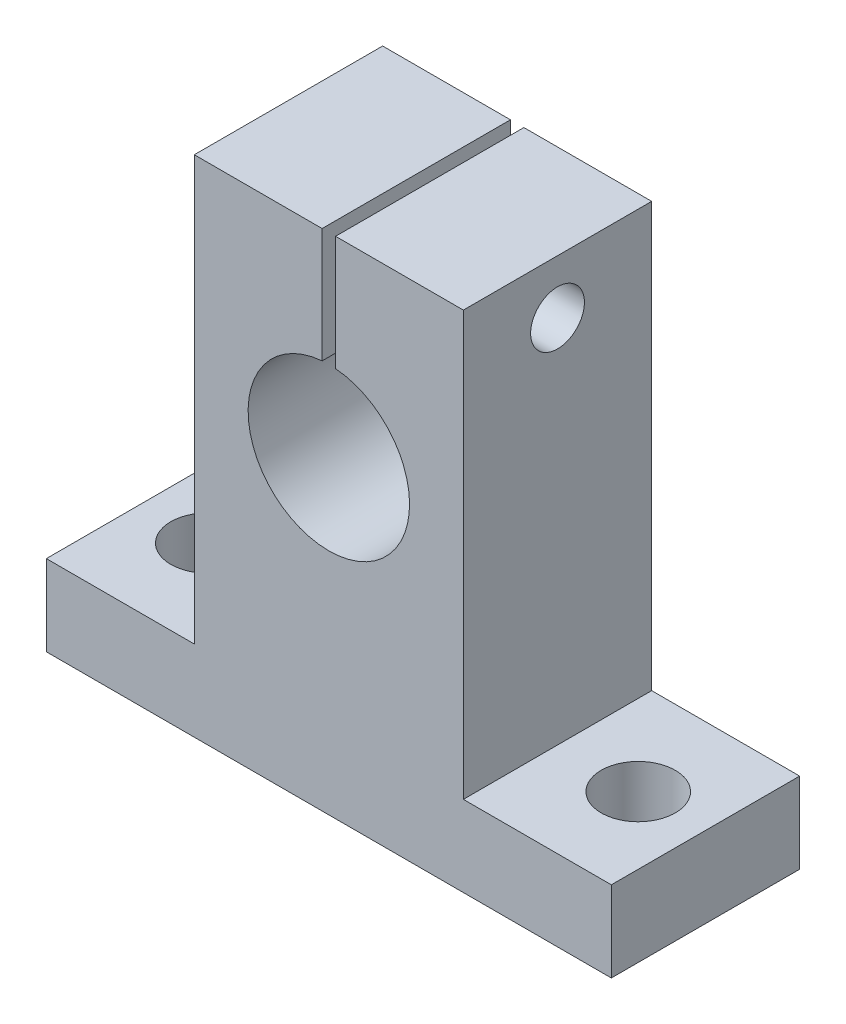
ISO-10303-21;
HEADER;
FILE_DESCRIPTION(('STEP AP214'),'2;1');
FILE_NAME('part.step','',(''),(''),'','','');
FILE_SCHEMA(('AUTOMOTIVE_DESIGN { 1 0 10303 214 1 1 1 1 }'));
ENDSEC;
DATA;
#1=APPLICATION_CONTEXT('core data for automotive mechanical design processes');
#2=APPLICATION_PROTOCOL_DEFINITION('international standard','automotive_design',2000,#1);
#3=PRODUCT_CONTEXT('',#1,'mechanical');
#4=PRODUCT('Part','Part','',(#3));
#5=PRODUCT_RELATED_PRODUCT_CATEGORY('part','',(#4));
#6=PRODUCT_DEFINITION_FORMATION('','',#4);
#7=PRODUCT_DEFINITION_CONTEXT('part definition',#1,'design');
#8=PRODUCT_DEFINITION('design','',#6,#7);
#9=PRODUCT_DEFINITION_SHAPE('','',#8);
#10=(LENGTH_UNIT() NAMED_UNIT(*) SI_UNIT(.MILLI.,.METRE.));
#11=(NAMED_UNIT(*) PLANE_ANGLE_UNIT() SI_UNIT($,.RADIAN.));
#12=(NAMED_UNIT(*) SI_UNIT($,.STERADIAN.) SOLID_ANGLE_UNIT());
#13=UNCERTAINTY_MEASURE_WITH_UNIT(LENGTH_MEASURE(1.E-05),#10,'distance_accuracy_value','');
#14=(GEOMETRIC_REPRESENTATION_CONTEXT(3) GLOBAL_UNCERTAINTY_ASSIGNED_CONTEXT((#13)) GLOBAL_UNIT_ASSIGNED_CONTEXT((#10,
#11,#12)) REPRESENTATION_CONTEXT('',''));
#15=CARTESIAN_POINT('',(0.,0.,0.));
#16=DIRECTION('',(0.,0.,1.));
#17=DIRECTION('',(1.,0.,0.));
#18=AXIS2_PLACEMENT_3D('',#15,#16,#17);
#19=CARTESIAN_POINT('',(0.,0.,14.));
#20=DIRECTION('',(0.,0.,-1.));
#21=DIRECTION('',(-1.,0.,0.));
#22=AXIS2_PLACEMENT_3D('',#19,#20,#21);
#23=PLANE('',#22);
#24=DIRECTION('',(0.,-1.,0.));
#25=VECTOR('',#24,1.);
#26=CARTESIAN_POINT('',(0.499999999999999,37.5,14.));
#27=LINE('',#26,#25);
#28=CARTESIAN_POINT('',(0.499999999999999,37.5,14.));
#29=VERTEX_POINT('',#28);
#30=CARTESIAN_POINT('',(0.5,28.9791303715507,14.));
#31=VERTEX_POINT('',#30);
#32=EDGE_CURVE('E127',#29,#31,#27,.T.);
#33=ORIENTED_EDGE('',*,*,#32,.T.);
#34=CARTESIAN_POINT('',(0.,23.,14.));
#35=DIRECTION('',(0.,0.,1.));
#36=DIRECTION('',(1.,0.,0.));
#37=AXIS2_PLACEMENT_3D('',#34,#35,#36);
#38=CIRCLE('',#37,6.);
#39=CARTESIAN_POINT('',(-0.499999999999999,28.9791303715507,14.));
#40=VERTEX_POINT('',#39);
#41=EDGE_CURVE('E172',#40,#31,#38,.T.);
#42=ORIENTED_EDGE('',*,*,#41,.F.);
#43=DIRECTION('',(0.,-1.,0.));
#44=VECTOR('',#43,1.);
#45=CARTESIAN_POINT('',(-0.5,37.5,14.));
#46=LINE('',#45,#44);
#47=CARTESIAN_POINT('',(-0.5,37.5,14.));
#48=VERTEX_POINT('',#47);
#49=EDGE_CURVE('E63',#48,#40,#46,.T.);
#50=ORIENTED_EDGE('',*,*,#49,.F.);
#51=DIRECTION('',(-1.,0.,0.));
#52=VECTOR('',#51,1.);
#53=CARTESIAN_POINT('',(-10.,37.5,14.));
#54=LINE('',#53,#52);
#55=CARTESIAN_POINT('',(-10.,37.5,14.));
#56=VERTEX_POINT('',#55);
#57=EDGE_CURVE('E155',#48,#56,#54,.T.);
#58=ORIENTED_EDGE('',*,*,#57,.T.);
#59=DIRECTION('',(0.,-1.,0.));
#60=VECTOR('',#59,1.);
#61=CARTESIAN_POINT('',(-10.,6.,14.));
#62=LINE('',#61,#60);
#63=CARTESIAN_POINT('',(-10.,6.,14.));
#64=VERTEX_POINT('',#63);
#65=EDGE_CURVE('E154',#56,#64,#62,.T.);
#66=ORIENTED_EDGE('',*,*,#65,.T.);
#67=DIRECTION('',(-1.,0.,0.));
#68=VECTOR('',#67,1.);
#69=CARTESIAN_POINT('',(-21.,6.,14.));
#70=LINE('',#69,#68);
#71=CARTESIAN_POINT('',(-21.,6.,14.));
#72=VERTEX_POINT('',#71);
#73=EDGE_CURVE('E159',#64,#72,#70,.T.);
#74=ORIENTED_EDGE('',*,*,#73,.T.);
#75=DIRECTION('',(0.,-1.,0.));
#76=VECTOR('',#75,1.);
#77=CARTESIAN_POINT('',(-21.,0.,14.));
#78=LINE('',#77,#76);
#79=CARTESIAN_POINT('',(-21.,0.,14.));
#80=VERTEX_POINT('',#79);
#81=EDGE_CURVE('E193',#72,#80,#78,.T.);
#82=ORIENTED_EDGE('',*,*,#81,.T.);
#83=DIRECTION('',(1.,0.,0.));
#84=VECTOR('',#83,1.);
#85=CARTESIAN_POINT('',(-21.,0.,14.));
#86=LINE('',#85,#84);
#87=CARTESIAN_POINT('',(21.,0.,14.));
#88=VERTEX_POINT('',#87);
#89=EDGE_CURVE('E249',#80,#88,#86,.T.);
#90=ORIENTED_EDGE('',*,*,#89,.T.);
#91=DIRECTION('',(0.,1.,0.));
#92=VECTOR('',#91,1.);
#93=CARTESIAN_POINT('',(21.,0.,14.));
#94=LINE('',#93,#92);
#95=CARTESIAN_POINT('',(21.,6.00000000000001,14.));
#96=VERTEX_POINT('',#95);
#97=EDGE_CURVE('E252',#88,#96,#94,.T.);
#98=ORIENTED_EDGE('',*,*,#97,.T.);
#99=DIRECTION('',(-1.,0.,0.));
#100=VECTOR('',#99,1.);
#101=CARTESIAN_POINT('',(10.,6.,14.));
#102=LINE('',#101,#100);
#103=CARTESIAN_POINT('',(10.,6.,14.));
#104=VERTEX_POINT('',#103);
#105=EDGE_CURVE('E254',#96,#104,#102,.T.);
#106=ORIENTED_EDGE('',*,*,#105,.T.);
#107=DIRECTION('',(0.,1.,0.));
#108=VECTOR('',#107,1.);
#109=CARTESIAN_POINT('',(10.,6.,14.));
#110=LINE('',#109,#108);
#111=CARTESIAN_POINT('',(10.,37.5,14.));
#112=VERTEX_POINT('',#111);
#113=EDGE_CURVE('E151',#104,#112,#110,.T.);
#114=ORIENTED_EDGE('',*,*,#113,.T.);
#115=EDGE_CURVE('E143',#112,#29,#54,.T.);
#116=ORIENTED_EDGE('',*,*,#115,.T.);
#117=EDGE_LOOP('',(#33,#42,#50,#58,#66,#74,#82,#90,#98,#106,#114,#116));
#118=FACE_BOUND('',#117,.T.);
#119=ADVANCED_FACE('F39',(#118),#23,.F.);
#120=CARTESIAN_POINT('',(0.,0.,0.));
#121=DIRECTION('',(0.,0.,-1.));
#122=DIRECTION('',(-1.,0.,0.));
#123=AXIS2_PLACEMENT_3D('',#120,#121,#122);
#124=PLANE('',#123);
#125=CARTESIAN_POINT('',(0.,23.,0.));
#126=DIRECTION('',(0.,0.,1.));
#127=DIRECTION('',(1.,0.,0.));
#128=AXIS2_PLACEMENT_3D('',#125,#126,#127);
#129=CIRCLE('',#128,6.);
#130=CARTESIAN_POINT('',(-0.499999999999999,28.9791303715507,0.));
#131=VERTEX_POINT('',#130);
#132=CARTESIAN_POINT('',(0.5,28.9791303715507,0.));
#133=VERTEX_POINT('',#132);
#134=EDGE_CURVE('E234',#131,#133,#129,.T.);
#135=ORIENTED_EDGE('',*,*,#134,.T.);
#136=DIRECTION('',(0.,1.,0.));
#137=VECTOR('',#136,1.);
#138=CARTESIAN_POINT('',(0.500000000000003,0.,0.));
#139=LINE('',#138,#137);
#140=CARTESIAN_POINT('',(0.499999999999999,37.5,0.));
#141=VERTEX_POINT('',#140);
#142=EDGE_CURVE('E56',#133,#141,#139,.T.);
#143=ORIENTED_EDGE('',*,*,#142,.T.);
#144=DIRECTION('',(-1.,0.,0.));
#145=VECTOR('',#144,1.);
#146=CARTESIAN_POINT('',(-10.,37.5,0.));
#147=LINE('',#146,#145);
#148=CARTESIAN_POINT('',(10.,37.5,0.));
#149=VERTEX_POINT('',#148);
#150=EDGE_CURVE('E145',#149,#141,#147,.T.);
#151=ORIENTED_EDGE('',*,*,#150,.F.);
#152=DIRECTION('',(0.,1.,0.));
#153=VECTOR('',#152,1.);
#154=CARTESIAN_POINT('',(10.,6.,0.));
#155=LINE('',#154,#153);
#156=CARTESIAN_POINT('',(10.,6.,0.));
#157=VERTEX_POINT('',#156);
#158=EDGE_CURVE('E181',#157,#149,#155,.T.);
#159=ORIENTED_EDGE('',*,*,#158,.F.);
#160=DIRECTION('',(-1.,0.,0.));
#161=VECTOR('',#160,1.);
#162=CARTESIAN_POINT('',(10.,6.,0.));
#163=LINE('',#162,#161);
#164=CARTESIAN_POINT('',(21.,6.00000000000001,0.));
#165=VERTEX_POINT('',#164);
#166=EDGE_CURVE('E178',#165,#157,#163,.T.);
#167=ORIENTED_EDGE('',*,*,#166,.F.);
#168=DIRECTION('',(0.,1.,0.));
#169=VECTOR('',#168,1.);
#170=CARTESIAN_POINT('',(21.,0.,0.));
#171=LINE('',#170,#169);
#172=CARTESIAN_POINT('',(21.,0.,0.));
#173=VERTEX_POINT('',#172);
#174=EDGE_CURVE('E175',#173,#165,#171,.T.);
#175=ORIENTED_EDGE('',*,*,#174,.F.);
#176=DIRECTION('',(1.,0.,0.));
#177=VECTOR('',#176,1.);
#178=CARTESIAN_POINT('',(-21.,0.,0.));
#179=LINE('',#178,#177);
#180=CARTESIAN_POINT('',(-21.,0.,0.));
#181=VERTEX_POINT('',#180);
#182=EDGE_CURVE('E171',#181,#173,#179,.T.);
#183=ORIENTED_EDGE('',*,*,#182,.F.);
#184=DIRECTION('',(0.,-1.,0.));
#185=VECTOR('',#184,1.);
#186=CARTESIAN_POINT('',(-21.,0.,0.));
#187=LINE('',#186,#185);
#188=CARTESIAN_POINT('',(-21.,6.,0.));
#189=VERTEX_POINT('',#188);
#190=EDGE_CURVE('E167',#189,#181,#187,.T.);
#191=ORIENTED_EDGE('',*,*,#190,.F.);
#192=DIRECTION('',(-1.,0.,0.));
#193=VECTOR('',#192,1.);
#194=CARTESIAN_POINT('',(-21.,6.,0.));
#195=LINE('',#194,#193);
#196=CARTESIAN_POINT('',(-10.,6.,0.));
#197=VERTEX_POINT('',#196);
#198=EDGE_CURVE('E190',#197,#189,#195,.T.);
#199=ORIENTED_EDGE('',*,*,#198,.F.);
#200=DIRECTION('',(0.,-1.,0.));
#201=VECTOR('',#200,1.);
#202=CARTESIAN_POINT('',(-10.,6.,0.));
#203=LINE('',#202,#201);
#204=CARTESIAN_POINT('',(-10.,37.5,0.));
#205=VERTEX_POINT('',#204);
#206=EDGE_CURVE('E187',#205,#197,#203,.T.);
#207=ORIENTED_EDGE('',*,*,#206,.F.);
#208=CARTESIAN_POINT('',(-0.5,37.5,0.));
#209=VERTEX_POINT('',#208);
#210=EDGE_CURVE('E184',#209,#205,#147,.T.);
#211=ORIENTED_EDGE('',*,*,#210,.F.);
#212=DIRECTION('',(0.,1.,0.));
#213=VECTOR('',#212,1.);
#214=CARTESIAN_POINT('',(-0.499999999999996,0.,0.));
#215=LINE('',#214,#213);
#216=EDGE_CURVE('E147',#131,#209,#215,.T.);
#217=ORIENTED_EDGE('',*,*,#216,.F.);
#218=EDGE_LOOP('',(#135,#143,#151,#159,#167,#175,#183,#191,#199,#207,#211,#217));
#219=FACE_BOUND('',#218,.T.);
#220=ADVANCED_FACE('F233',(#219),#124,.T.);
#221=CARTESIAN_POINT('',(-10.,37.5,14.));
#222=DIRECTION('',(0.,-1.,0.));
#223=DIRECTION('',(0.,0.,-1.));
#224=AXIS2_PLACEMENT_3D('',#221,#222,#223);
#225=PLANE('',#224);
#226=DIRECTION('',(0.,0.,1.));
#227=VECTOR('',#226,1.);
#228=CARTESIAN_POINT('',(0.499999999999999,37.5,-5.));
#229=LINE('',#228,#227);
#230=EDGE_CURVE('E130',#141,#29,#229,.T.);
#231=ORIENTED_EDGE('',*,*,#230,.T.);
#232=ORIENTED_EDGE('',*,*,#115,.F.);
#233=DIRECTION('',(0.,0.,-1.));
#234=VECTOR('',#233,1.);
#235=CARTESIAN_POINT('',(10.,37.5,14.));
#236=LINE('',#235,#234);
#237=EDGE_CURVE('E205',#112,#149,#236,.T.);
#238=ORIENTED_EDGE('',*,*,#237,.T.);
#239=ORIENTED_EDGE('',*,*,#150,.T.);
#240=EDGE_LOOP('',(#231,#232,#238,#239));
#241=FACE_BOUND('',#240,.T.);
#242=ADVANCED_FACE('F141',(#241),#225,.F.);
#243=CARTESIAN_POINT('',(0.,23.,14.));
#244=DIRECTION('',(0.,0.,-1.));
#245=DIRECTION('',(-1.,0.,0.));
#246=AXIS2_PLACEMENT_3D('',#243,#244,#245);
#247=CYLINDRICAL_SURFACE('',#246,6.);
#248=ORIENTED_EDGE('',*,*,#41,.T.);
#249=DIRECTION('',(0.,0.,-1.));
#250=VECTOR('',#249,1.);
#251=CARTESIAN_POINT('',(0.5,28.9791303715507,14.));
#252=LINE('',#251,#250);
#253=EDGE_CURVE('E11',#31,#133,#252,.T.);
#254=ORIENTED_EDGE('',*,*,#253,.T.);
#255=ORIENTED_EDGE('',*,*,#134,.F.);
#256=DIRECTION('',(0.,0.,-1.));
#257=VECTOR('',#256,1.);
#258=CARTESIAN_POINT('',(-0.499999999999999,28.9791303715507,14.));
#259=LINE('',#258,#257);
#260=EDGE_CURVE('E49',#40,#131,#259,.T.);
#261=ORIENTED_EDGE('',*,*,#260,.F.);
#262=EDGE_LOOP('',(#248,#254,#255,#261));
#263=FACE_BOUND('',#262,.T.);
#264=ADVANCED_FACE('F238',(#263),#247,.F.);
#265=CARTESIAN_POINT('',(-21.,0.,14.));
#266=DIRECTION('',(1.,0.,0.));
#267=DIRECTION('',(0.,0.,-1.));
#268=AXIS2_PLACEMENT_3D('',#265,#266,#267);
#269=PLANE('',#268);
#270=ORIENTED_EDGE('',*,*,#190,.T.);
#271=DIRECTION('',(0.,0.,-1.));
#272=VECTOR('',#271,1.);
#273=CARTESIAN_POINT('',(-21.,0.,14.));
#274=LINE('',#273,#272);
#275=EDGE_CURVE('E220',#80,#181,#274,.T.);
#276=ORIENTED_EDGE('',*,*,#275,.F.);
#277=ORIENTED_EDGE('',*,*,#81,.F.);
#278=DIRECTION('',(0.,0.,-1.));
#279=VECTOR('',#278,1.);
#280=CARTESIAN_POINT('',(-21.,6.,14.));
#281=LINE('',#280,#279);
#282=EDGE_CURVE('E166',#72,#189,#281,.T.);
#283=ORIENTED_EDGE('',*,*,#282,.T.);
#284=EDGE_LOOP('',(#270,#276,#277,#283));
#285=FACE_BOUND('',#284,.T.);
#286=ADVANCED_FACE('F41',(#285),#269,.F.);
#287=CARTESIAN_POINT('',(-21.,0.,14.));
#288=DIRECTION('',(0.,1.,0.));
#289=DIRECTION('',(-1.,0.,0.));
#290=AXIS2_PLACEMENT_3D('',#287,#288,#289);
#291=PLANE('',#290);
#292=CARTESIAN_POINT('',(16.,0.,7.));
#293=DIRECTION('',(0.,1.,0.));
#294=DIRECTION('',(-1.,0.,0.));
#295=AXIS2_PLACEMENT_3D('',#292,#293,#294);
#296=CIRCLE('',#295,2.75);
#297=CARTESIAN_POINT('',(13.25,0.,7.));
#298=VERTEX_POINT('',#297);
#299=EDGE_CURVE('E307',#298,#298,#296,.T.);
#300=ORIENTED_EDGE('',*,*,#299,.T.);
#301=EDGE_LOOP('',(#300));
#302=FACE_BOUND('',#301,.T.);
#303=CARTESIAN_POINT('',(-16.,0.,6.99999999999999));
#304=DIRECTION('',(0.,1.,0.));
#305=DIRECTION('',(-1.,0.,0.));
#306=AXIS2_PLACEMENT_3D('',#303,#304,#305);
#307=CIRCLE('',#306,2.75);
#308=CARTESIAN_POINT('',(-18.75,0.,6.99999999999999));
#309=VERTEX_POINT('',#308);
#310=EDGE_CURVE('E311',#309,#309,#307,.T.);
#311=ORIENTED_EDGE('',*,*,#310,.T.);
#312=EDGE_LOOP('',(#311));
#313=FACE_BOUND('',#312,.T.);
#314=ORIENTED_EDGE('',*,*,#182,.T.);
#315=DIRECTION('',(0.,0.,-1.));
#316=VECTOR('',#315,1.);
#317=CARTESIAN_POINT('',(21.,0.,14.));
#318=LINE('',#317,#316);
#319=EDGE_CURVE('E216',#88,#173,#318,.T.);
#320=ORIENTED_EDGE('',*,*,#319,.F.);
#321=ORIENTED_EDGE('',*,*,#89,.F.);
#322=ORIENTED_EDGE('',*,*,#275,.T.);
#323=EDGE_LOOP('',(#314,#320,#321,#322));
#324=FACE_BOUND('',#323,.T.);
#325=ADVANCED_FACE('F273',(#302,#313,#324),#291,.F.);
#326=CARTESIAN_POINT('',(21.,0.,14.));
#327=DIRECTION('',(-1.,0.,0.));
#328=DIRECTION('',(0.,0.,1.));
#329=AXIS2_PLACEMENT_3D('',#326,#327,#328);
#330=PLANE('',#329);
#331=ORIENTED_EDGE('',*,*,#174,.T.);
#332=DIRECTION('',(0.,0.,-1.));
#333=VECTOR('',#332,1.);
#334=CARTESIAN_POINT('',(21.,6.00000000000001,14.));
#335=LINE('',#334,#333);
#336=EDGE_CURVE('E212',#96,#165,#335,.T.);
#337=ORIENTED_EDGE('',*,*,#336,.F.);
#338=ORIENTED_EDGE('',*,*,#97,.F.);
#339=ORIENTED_EDGE('',*,*,#319,.T.);
#340=EDGE_LOOP('',(#331,#337,#338,#339));
#341=FACE_BOUND('',#340,.T.);
#342=ADVANCED_FACE('F270',(#341),#330,.F.);
#343=CARTESIAN_POINT('',(10.,6.,14.));
#344=DIRECTION('',(0.,-1.,0.));
#345=DIRECTION('',(1.,0.,0.));
#346=AXIS2_PLACEMENT_3D('',#343,#344,#345);
#347=PLANE('',#346);
#348=CARTESIAN_POINT('',(16.,6.,7.));
#349=DIRECTION('',(0.,1.,0.));
#350=DIRECTION('',(-1.,0.,0.));
#351=AXIS2_PLACEMENT_3D('',#348,#349,#350);
#352=CIRCLE('',#351,2.75);
#353=CARTESIAN_POINT('',(13.25,6.,7.));
#354=VERTEX_POINT('',#353);
#355=EDGE_CURVE('E315',#354,#354,#352,.T.);
#356=ORIENTED_EDGE('',*,*,#355,.F.);
#357=EDGE_LOOP('',(#356));
#358=FACE_BOUND('',#357,.T.);
#359=ORIENTED_EDGE('',*,*,#166,.T.);
#360=DIRECTION('',(0.,0.,-1.));
#361=VECTOR('',#360,1.);
#362=CARTESIAN_POINT('',(10.,6.,14.));
#363=LINE('',#362,#361);
#364=EDGE_CURVE('E208',#104,#157,#363,.T.);
#365=ORIENTED_EDGE('',*,*,#364,.F.);
#366=ORIENTED_EDGE('',*,*,#105,.F.);
#367=ORIENTED_EDGE('',*,*,#336,.T.);
#368=EDGE_LOOP('',(#359,#365,#366,#367));
#369=FACE_BOUND('',#368,.T.);
#370=ADVANCED_FACE('F262',(#358,#369),#347,.F.);
#371=CARTESIAN_POINT('',(10.,6.,14.));
#372=DIRECTION('',(-1.,0.,0.));
#373=DIRECTION('',(0.,-1.,0.));
#374=AXIS2_PLACEMENT_3D('',#371,#372,#373);
#375=PLANE('',#374);
#376=CARTESIAN_POINT('',(10.,33.5,7.));
#377=DIRECTION('',(1.,0.,0.));
#378=DIRECTION('',(0.,0.,-1.));
#379=AXIS2_PLACEMENT_3D('',#376,#377,#378);
#380=CIRCLE('',#379,2.);
#381=CARTESIAN_POINT('',(10.,33.5,5.));
#382=VERTEX_POINT('',#381);
#383=EDGE_CURVE('E303',#382,#382,#380,.T.);
#384=ORIENTED_EDGE('',*,*,#383,.F.);
#385=EDGE_LOOP('',(#384));
#386=FACE_BOUND('',#385,.T.);
#387=ORIENTED_EDGE('',*,*,#158,.T.);
#388=ORIENTED_EDGE('',*,*,#237,.F.);
#389=ORIENTED_EDGE('',*,*,#113,.F.);
#390=ORIENTED_EDGE('',*,*,#364,.T.);
#391=EDGE_LOOP('',(#387,#388,#389,#390));
#392=FACE_BOUND('',#391,.T.);
#393=ADVANCED_FACE('F266',(#386,#392),#375,.F.);
#394=ORIENTED_EDGE('',*,*,#57,.F.);
#395=DIRECTION('',(0.,0.,1.));
#396=VECTOR('',#395,1.);
#397=CARTESIAN_POINT('',(-0.5,37.5,-5.));
#398=LINE('',#397,#396);
#399=EDGE_CURVE('E148',#209,#48,#398,.T.);
#400=ORIENTED_EDGE('',*,*,#399,.F.);
#401=ORIENTED_EDGE('',*,*,#210,.T.);
#402=DIRECTION('',(0.,0.,-1.));
#403=VECTOR('',#402,1.);
#404=CARTESIAN_POINT('',(-10.,37.5,14.));
#405=LINE('',#404,#403);
#406=EDGE_CURVE('E201',#56,#205,#405,.T.);
#407=ORIENTED_EDGE('',*,*,#406,.F.);
#408=EDGE_LOOP('',(#394,#400,#401,#407));
#409=FACE_BOUND('',#408,.T.);
#410=ADVANCED_FACE('F289',(#409),#225,.F.);
#411=CARTESIAN_POINT('',(-10.,6.,14.));
#412=DIRECTION('',(1.,0.,0.));
#413=DIRECTION('',(0.,1.,0.));
#414=AXIS2_PLACEMENT_3D('',#411,#412,#413);
#415=PLANE('',#414);
#416=CARTESIAN_POINT('',(-10.,33.5,7.));
#417=DIRECTION('',(1.,0.,0.));
#418=DIRECTION('',(0.,1.,0.));
#419=AXIS2_PLACEMENT_3D('',#416,#417,#418);
#420=CIRCLE('',#419,2.);
#421=CARTESIAN_POINT('',(-10.,35.5,7.));
#422=VERTEX_POINT('',#421);
#423=EDGE_CURVE('E136',#422,#422,#420,.T.);
#424=ORIENTED_EDGE('',*,*,#423,.T.);
#425=EDGE_LOOP('',(#424));
#426=FACE_BOUND('',#425,.T.);
#427=ORIENTED_EDGE('',*,*,#206,.T.);
#428=DIRECTION('',(0.,0.,-1.));
#429=VECTOR('',#428,1.);
#430=CARTESIAN_POINT('',(-10.,6.,14.));
#431=LINE('',#430,#429);
#432=EDGE_CURVE('E197',#64,#197,#431,.T.);
#433=ORIENTED_EDGE('',*,*,#432,.F.);
#434=ORIENTED_EDGE('',*,*,#65,.F.);
#435=ORIENTED_EDGE('',*,*,#406,.T.);
#436=EDGE_LOOP('',(#427,#433,#434,#435));
#437=FACE_BOUND('',#436,.T.);
#438=ADVANCED_FACE('F285',(#426,#437),#415,.F.);
#439=CARTESIAN_POINT('',(-21.,6.,14.));
#440=DIRECTION('',(0.,-1.,0.));
#441=DIRECTION('',(0.,0.,-1.));
#442=AXIS2_PLACEMENT_3D('',#439,#440,#441);
#443=PLANE('',#442);
#444=CARTESIAN_POINT('',(-16.,6.,6.99999999999999));
#445=DIRECTION('',(0.,1.,0.));
#446=DIRECTION('',(1.,0.,0.));
#447=AXIS2_PLACEMENT_3D('',#444,#445,#446);
#448=CIRCLE('',#447,2.75);
#449=CARTESIAN_POINT('',(-13.25,6.,6.99999999999999));
#450=VERTEX_POINT('',#449);
#451=EDGE_CURVE('E316',#450,#450,#448,.T.);
#452=ORIENTED_EDGE('',*,*,#451,.F.);
#453=EDGE_LOOP('',(#452));
#454=FACE_BOUND('',#453,.T.);
#455=ORIENTED_EDGE('',*,*,#198,.T.);
#456=ORIENTED_EDGE('',*,*,#282,.F.);
#457=ORIENTED_EDGE('',*,*,#73,.F.);
#458=ORIENTED_EDGE('',*,*,#432,.T.);
#459=EDGE_LOOP('',(#455,#456,#457,#458));
#460=FACE_BOUND('',#459,.T.);
#461=ADVANCED_FACE('F280',(#454,#460),#443,.F.);
#462=CARTESIAN_POINT('',(-0.5,37.5,-5.));
#463=DIRECTION('',(-1.,0.,0.));
#464=DIRECTION('',(0.,-1.,0.));
#465=AXIS2_PLACEMENT_3D('',#462,#463,#464);
#466=PLANE('',#465);
#467=CARTESIAN_POINT('',(-0.5,33.5,7.));
#468=DIRECTION('',(-1.,0.,0.));
#469=DIRECTION('',(0.,-1.,0.));
#470=AXIS2_PLACEMENT_3D('',#467,#468,#469);
#471=CIRCLE('',#470,2.);
#472=CARTESIAN_POINT('',(-0.5,31.5,7.));
#473=VERTEX_POINT('',#472);
#474=EDGE_CURVE('E299',#473,#473,#471,.T.);
#475=ORIENTED_EDGE('',*,*,#474,.T.);
#476=EDGE_LOOP('',(#475));
#477=FACE_BOUND('',#476,.T.);
#478=ORIENTED_EDGE('',*,*,#216,.T.);
#479=ORIENTED_EDGE('',*,*,#399,.T.);
#480=ORIENTED_EDGE('',*,*,#49,.T.);
#481=ORIENTED_EDGE('',*,*,#260,.T.);
#482=EDGE_LOOP('',(#478,#479,#480,#481));
#483=FACE_BOUND('',#482,.T.);
#484=ADVANCED_FACE('F226',(#477,#483),#466,.F.);
#485=CARTESIAN_POINT('',(0.499999999999999,37.5,-5.));
#486=DIRECTION('',(-1.,0.,0.));
#487=DIRECTION('',(0.,-1.,0.));
#488=AXIS2_PLACEMENT_3D('',#485,#486,#487);
#489=PLANE('',#488);
#490=CARTESIAN_POINT('',(0.5,33.5,7.));
#491=DIRECTION('',(-1.,0.,0.));
#492=DIRECTION('',(0.,-1.,0.));
#493=AXIS2_PLACEMENT_3D('',#490,#491,#492);
#494=CIRCLE('',#493,2.);
#495=CARTESIAN_POINT('',(0.500000000000001,31.5,7.));
#496=VERTEX_POINT('',#495);
#497=EDGE_CURVE('E43',#496,#496,#494,.T.);
#498=ORIENTED_EDGE('',*,*,#497,.F.);
#499=EDGE_LOOP('',(#498));
#500=FACE_BOUND('',#499,.T.);
#501=ORIENTED_EDGE('',*,*,#253,.F.);
#502=ORIENTED_EDGE('',*,*,#32,.F.);
#503=ORIENTED_EDGE('',*,*,#230,.F.);
#504=ORIENTED_EDGE('',*,*,#142,.F.);
#505=EDGE_LOOP('',(#501,#502,#503,#504));
#506=FACE_BOUND('',#505,.T.);
#507=ADVANCED_FACE('F129',(#500,#506),#489,.T.);
#508=CARTESIAN_POINT('',(-21.,33.5,7.));
#509=DIRECTION('',(1.,0.,0.));
#510=DIRECTION('',(0.,0.,-1.));
#511=AXIS2_PLACEMENT_3D('',#508,#509,#510);
#512=CYLINDRICAL_SURFACE('',#511,2.);
#513=ORIENTED_EDGE('',*,*,#497,.T.);
#514=EDGE_LOOP('',(#513));
#515=FACE_BOUND('',#514,.T.);
#516=ORIENTED_EDGE('',*,*,#383,.T.);
#517=EDGE_LOOP('',(#516));
#518=FACE_BOUND('',#517,.T.);
#519=ADVANCED_FACE('F381',(#515,#518),#512,.F.);
#520=ORIENTED_EDGE('',*,*,#474,.F.);
#521=EDGE_LOOP('',(#520));
#522=FACE_BOUND('',#521,.T.);
#523=ORIENTED_EDGE('',*,*,#423,.F.);
#524=EDGE_LOOP('',(#523));
#525=FACE_BOUND('',#524,.T.);
#526=ADVANCED_FACE('F373',(#522,#525),#512,.F.);
#527=CARTESIAN_POINT('',(-16.,-16.,6.99999999999999));
#528=DIRECTION('',(0.,1.,0.));
#529=DIRECTION('',(-1.,0.,0.));
#530=AXIS2_PLACEMENT_3D('',#527,#528,#529);
#531=CYLINDRICAL_SURFACE('',#530,2.75);
#532=ORIENTED_EDGE('',*,*,#451,.T.);
#533=EDGE_LOOP('',(#532));
#534=FACE_BOUND('',#533,.T.);
#535=ORIENTED_EDGE('',*,*,#310,.F.);
#536=EDGE_LOOP('',(#535));
#537=FACE_BOUND('',#536,.T.);
#538=ADVANCED_FACE('F371',(#534,#537),#531,.F.);
#539=CARTESIAN_POINT('',(16.,-16.,7.));
#540=DIRECTION('',(0.,1.,0.));
#541=DIRECTION('',(-1.,0.,0.));
#542=AXIS2_PLACEMENT_3D('',#539,#540,#541);
#543=CYLINDRICAL_SURFACE('',#542,2.75);
#544=ORIENTED_EDGE('',*,*,#355,.T.);
#545=EDGE_LOOP('',(#544));
#546=FACE_BOUND('',#545,.T.);
#547=ORIENTED_EDGE('',*,*,#299,.F.);
#548=EDGE_LOOP('',(#547));
#549=FACE_BOUND('',#548,.T.);
#550=ADVANCED_FACE('F324',(#546,#549),#543,.F.);
#551=CLOSED_SHELL('',(#119,#220,#242,#264,#286,#325,#342,#370,#393,#410,#438,#461,#484,#507,
#519,#526,#538,#550));
#552=MANIFOLD_SOLID_BREP('B2',#551);
#553=ADVANCED_BREP_SHAPE_REPRESENTATION('',(#18,#552),#14);
#554=SHAPE_DEFINITION_REPRESENTATION(#9,#553);
ENDSEC;
END-ISO-10303-21;
